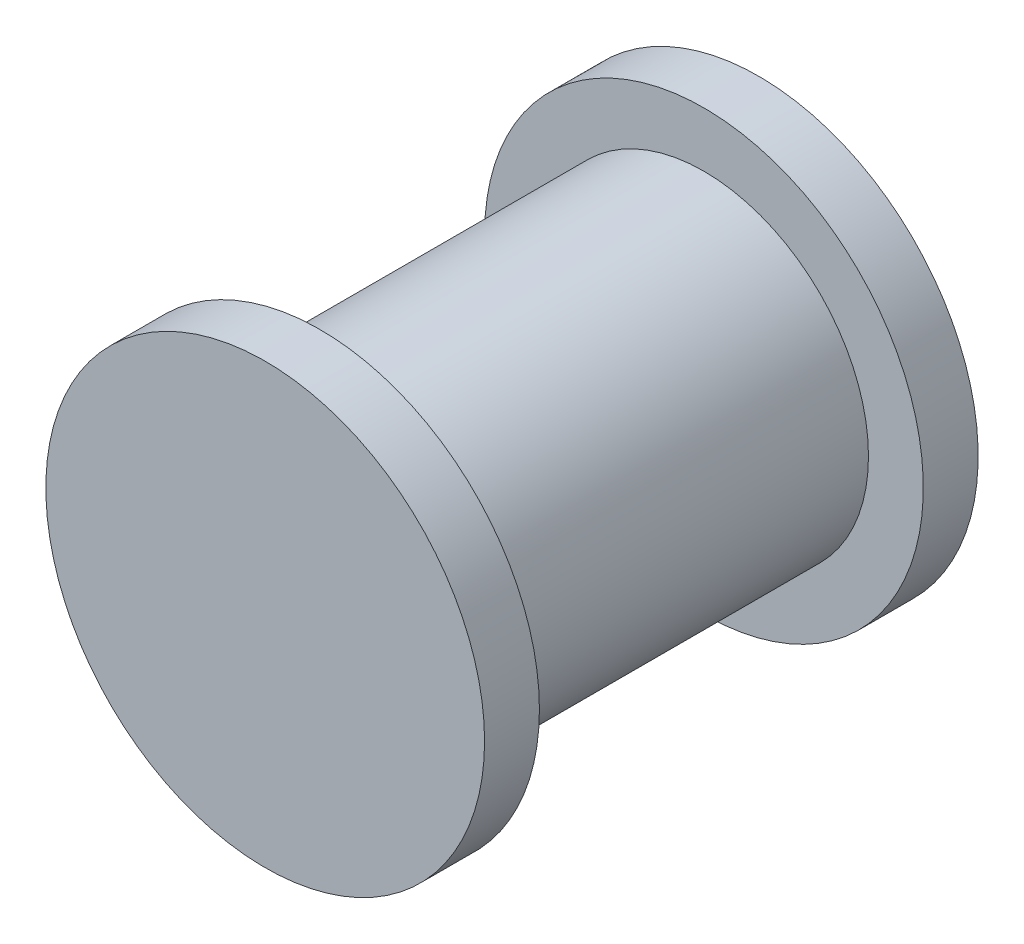
ISO-10303-21;
HEADER;
FILE_DESCRIPTION(('STEP AP214'),'2;1');
FILE_NAME('part.step','',(''),(''),'','','');
FILE_SCHEMA(('AUTOMOTIVE_DESIGN { 1 0 10303 214 1 1 1 1 }'));
ENDSEC;
DATA;
#1=APPLICATION_CONTEXT('core data for automotive mechanical design processes');
#2=APPLICATION_PROTOCOL_DEFINITION('international standard','automotive_design',2000,#1);
#3=PRODUCT_CONTEXT('',#1,'mechanical');
#4=PRODUCT('Part','Part','',(#3));
#5=PRODUCT_RELATED_PRODUCT_CATEGORY('part','',(#4));
#6=PRODUCT_DEFINITION_FORMATION('','',#4);
#7=PRODUCT_DEFINITION_CONTEXT('part definition',#1,'design');
#8=PRODUCT_DEFINITION('design','',#6,#7);
#9=PRODUCT_DEFINITION_SHAPE('','',#8);
#10=(LENGTH_UNIT() NAMED_UNIT(*) SI_UNIT(.MILLI.,.METRE.));
#11=(NAMED_UNIT(*) PLANE_ANGLE_UNIT() SI_UNIT($,.RADIAN.));
#12=(NAMED_UNIT(*) SI_UNIT($,.STERADIAN.) SOLID_ANGLE_UNIT());
#13=UNCERTAINTY_MEASURE_WITH_UNIT(LENGTH_MEASURE(1.E-05),#10,'distance_accuracy_value','');
#14=(GEOMETRIC_REPRESENTATION_CONTEXT(3) GLOBAL_UNCERTAINTY_ASSIGNED_CONTEXT((#13)) GLOBAL_UNIT_ASSIGNED_CONTEXT((#10,
#11,#12)) REPRESENTATION_CONTEXT('',''));
#15=CARTESIAN_POINT('',(0.,0.,0.));
#16=DIRECTION('',(0.,0.,1.));
#17=DIRECTION('',(1.,0.,0.));
#18=AXIS2_PLACEMENT_3D('',#15,#16,#17);
#19=CARTESIAN_POINT('',(0.,0.,17.78));
#20=DIRECTION('',(0.,0.,-1.));
#21=DIRECTION('',(-1.,0.,0.));
#22=AXIS2_PLACEMENT_3D('',#19,#20,#21);
#23=CYLINDRICAL_SURFACE('',#22,7.62);
#24=CARTESIAN_POINT('',(0.,0.,17.78));
#25=DIRECTION('',(0.,0.,1.));
#26=DIRECTION('',(1.,0.,0.));
#27=AXIS2_PLACEMENT_3D('',#24,#25,#26);
#28=CIRCLE('',#27,7.62);
#29=CARTESIAN_POINT('',(7.62,0.,17.78));
#30=VERTEX_POINT('',#29);
#31=EDGE_CURVE('E10',#30,#30,#28,.T.);
#32=ORIENTED_EDGE('',*,*,#31,.F.);
#33=EDGE_LOOP('',(#32));
#34=FACE_BOUND('',#33,.T.);
#35=CARTESIAN_POINT('',(0.,0.,0.));
#36=DIRECTION('',(0.,0.,-1.));
#37=DIRECTION('',(-1.,0.,0.));
#38=AXIS2_PLACEMENT_3D('',#35,#36,#37);
#39=CIRCLE('',#38,7.62);
#40=CARTESIAN_POINT('',(-7.62,0.,0.));
#41=VERTEX_POINT('',#40);
#42=EDGE_CURVE('E48',#41,#41,#39,.T.);
#43=ORIENTED_EDGE('',*,*,#42,.F.);
#44=EDGE_LOOP('',(#43));
#45=FACE_BOUND('',#44,.T.);
#46=ADVANCED_FACE('F33',(#34,#45),#23,.T.);
#47=CARTESIAN_POINT('',(0.,0.,20.32));
#48=DIRECTION('',(0.,0.,-1.));
#49=DIRECTION('',(-1.,0.,0.));
#50=AXIS2_PLACEMENT_3D('',#47,#48,#49);
#51=CYLINDRICAL_SURFACE('',#50,10.16);
#52=CARTESIAN_POINT('',(0.,0.,20.32));
#53=DIRECTION('',(0.,0.,1.));
#54=DIRECTION('',(1.,0.,0.));
#55=AXIS2_PLACEMENT_3D('',#52,#53,#54);
#56=CIRCLE('',#55,10.16);
#57=CARTESIAN_POINT('',(10.16,0.,20.32));
#58=VERTEX_POINT('',#57);
#59=EDGE_CURVE('E39',#58,#58,#56,.T.);
#60=ORIENTED_EDGE('',*,*,#59,.F.);
#61=EDGE_LOOP('',(#60));
#62=FACE_BOUND('',#61,.T.);
#63=CARTESIAN_POINT('',(0.,0.,17.78));
#64=DIRECTION('',(0.,0.,1.));
#65=DIRECTION('',(1.,0.,0.));
#66=AXIS2_PLACEMENT_3D('',#63,#64,#65);
#67=CIRCLE('',#66,10.16);
#68=CARTESIAN_POINT('',(10.16,0.,17.78));
#69=VERTEX_POINT('',#68);
#70=EDGE_CURVE('E43',#69,#69,#67,.T.);
#71=ORIENTED_EDGE('',*,*,#70,.T.);
#72=EDGE_LOOP('',(#71));
#73=FACE_BOUND('',#72,.T.);
#74=ADVANCED_FACE('F77',(#62,#73),#51,.T.);
#75=CARTESIAN_POINT('',(0.,0.,20.32));
#76=DIRECTION('',(0.,0.,1.));
#77=DIRECTION('',(1.,0.,0.));
#78=AXIS2_PLACEMENT_3D('',#75,#76,#77);
#79=PLANE('',#78);
#80=ORIENTED_EDGE('',*,*,#59,.T.);
#81=EDGE_LOOP('',(#80));
#82=FACE_BOUND('',#81,.T.);
#83=ADVANCED_FACE('F82',(#82),#79,.T.);
#84=CARTESIAN_POINT('',(0.,0.,17.78));
#85=DIRECTION('',(0.,0.,1.));
#86=DIRECTION('',(1.,0.,0.));
#87=AXIS2_PLACEMENT_3D('',#84,#85,#86);
#88=PLANE('',#87);
#89=ORIENTED_EDGE('',*,*,#31,.T.);
#90=EDGE_LOOP('',(#89));
#91=FACE_BOUND('',#90,.T.);
#92=ORIENTED_EDGE('',*,*,#70,.F.);
#93=EDGE_LOOP('',(#92));
#94=FACE_BOUND('',#93,.T.);
#95=ADVANCED_FACE('F64',(#91,#94),#88,.F.);
#96=CARTESIAN_POINT('',(0.,0.,-2.54));
#97=DIRECTION('',(0.,0.,1.));
#98=DIRECTION('',(1.,0.,0.));
#99=AXIS2_PLACEMENT_3D('',#96,#97,#98);
#100=CYLINDRICAL_SURFACE('',#99,10.16);
#101=CARTESIAN_POINT('',(0.,0.,-2.54));
#102=DIRECTION('',(0.,0.,-1.));
#103=DIRECTION('',(-1.,0.,0.));
#104=AXIS2_PLACEMENT_3D('',#101,#102,#103);
#105=CIRCLE('',#104,10.16);
#106=CARTESIAN_POINT('',(-10.16,0.,-2.54));
#107=VERTEX_POINT('',#106);
#108=EDGE_CURVE('E52',#107,#107,#105,.T.);
#109=ORIENTED_EDGE('',*,*,#108,.F.);
#110=EDGE_LOOP('',(#109));
#111=FACE_BOUND('',#110,.T.);
#112=CARTESIAN_POINT('',(0.,0.,0.));
#113=DIRECTION('',(0.,0.,-1.));
#114=DIRECTION('',(-1.,0.,0.));
#115=AXIS2_PLACEMENT_3D('',#112,#113,#114);
#116=CIRCLE('',#115,10.16);
#117=CARTESIAN_POINT('',(-10.16,0.,0.));
#118=VERTEX_POINT('',#117);
#119=EDGE_CURVE('E53',#118,#118,#116,.T.);
#120=ORIENTED_EDGE('',*,*,#119,.T.);
#121=EDGE_LOOP('',(#120));
#122=FACE_BOUND('',#121,.T.);
#123=ADVANCED_FACE('F61',(#111,#122),#100,.T.);
#124=CARTESIAN_POINT('',(0.,0.,-2.54));
#125=DIRECTION('',(0.,0.,-1.));
#126=DIRECTION('',(-1.,0.,0.));
#127=AXIS2_PLACEMENT_3D('',#124,#125,#126);
#128=PLANE('',#127);
#129=ORIENTED_EDGE('',*,*,#108,.T.);
#130=EDGE_LOOP('',(#129));
#131=FACE_BOUND('',#130,.T.);
#132=ADVANCED_FACE('F59',(#131),#128,.T.);
#133=CARTESIAN_POINT('',(0.,0.,0.));
#134=DIRECTION('',(0.,0.,-1.));
#135=DIRECTION('',(-1.,0.,0.));
#136=AXIS2_PLACEMENT_3D('',#133,#134,#135);
#137=PLANE('',#136);
#138=ORIENTED_EDGE('',*,*,#42,.T.);
#139=EDGE_LOOP('',(#138));
#140=FACE_BOUND('',#139,.T.);
#141=ORIENTED_EDGE('',*,*,#119,.F.);
#142=EDGE_LOOP('',(#141));
#143=FACE_BOUND('',#142,.T.);
#144=ADVANCED_FACE('F68',(#140,#143),#137,.F.);
#145=CLOSED_SHELL('',(#46,#74,#83,#95,#123,#132,#144));
#146=MANIFOLD_SOLID_BREP('B2',#145);
#147=ADVANCED_BREP_SHAPE_REPRESENTATION('',(#18,#146),#14);
#148=SHAPE_DEFINITION_REPRESENTATION(#9,#147);
ENDSEC;
END-ISO-10303-21;
